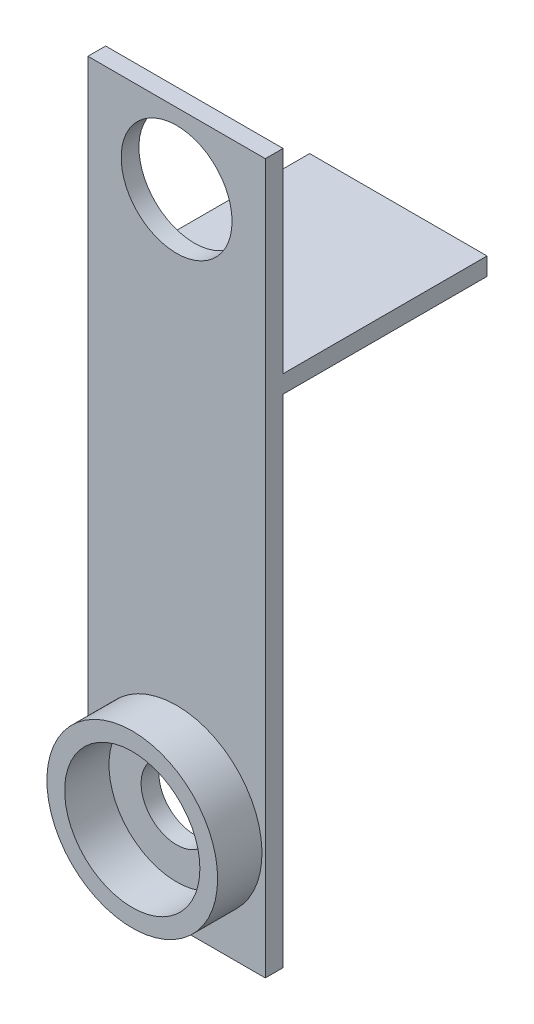
ISO-10303-21;
HEADER;
FILE_DESCRIPTION(('STEP AP214'),'2;1');
FILE_NAME('part.step','',(''),(''),'','','');
FILE_SCHEMA(('AUTOMOTIVE_DESIGN { 1 0 10303 214 1 1 1 1 }'));
ENDSEC;
DATA;
#1=APPLICATION_CONTEXT('core data for automotive mechanical design processes');
#2=APPLICATION_PROTOCOL_DEFINITION('international standard','automotive_design',2000,#1);
#3=PRODUCT_CONTEXT('',#1,'mechanical');
#4=PRODUCT('Part','Part','',(#3));
#5=PRODUCT_RELATED_PRODUCT_CATEGORY('part','',(#4));
#6=PRODUCT_DEFINITION_FORMATION('','',#4);
#7=PRODUCT_DEFINITION_CONTEXT('part definition',#1,'design');
#8=PRODUCT_DEFINITION('design','',#6,#7);
#9=PRODUCT_DEFINITION_SHAPE('','',#8);
#10=(LENGTH_UNIT() NAMED_UNIT(*) SI_UNIT(.MILLI.,.METRE.));
#11=(NAMED_UNIT(*) PLANE_ANGLE_UNIT() SI_UNIT($,.RADIAN.));
#12=(NAMED_UNIT(*) SI_UNIT($,.STERADIAN.) SOLID_ANGLE_UNIT());
#13=UNCERTAINTY_MEASURE_WITH_UNIT(LENGTH_MEASURE(1.E-05),#10,'distance_accuracy_value','');
#14=(GEOMETRIC_REPRESENTATION_CONTEXT(3) GLOBAL_UNCERTAINTY_ASSIGNED_CONTEXT((#13)) GLOBAL_UNIT_ASSIGNED_CONTEXT((#10,
#11,#12)) REPRESENTATION_CONTEXT('',''));
#15=CARTESIAN_POINT('',(0.,0.,0.));
#16=DIRECTION('',(0.,0.,1.));
#17=DIRECTION('',(1.,0.,0.));
#18=AXIS2_PLACEMENT_3D('',#15,#16,#17);
#19=CARTESIAN_POINT('',(20.,22.,2.));
#20=DIRECTION('',(0.,0.,-1.));
#21=DIRECTION('',(0.,1.,0.));
#22=AXIS2_PLACEMENT_3D('',#19,#20,#21);
#23=PLANE('',#22);
#24=CARTESIAN_POINT('',(10.,-46.,2.));
#25=DIRECTION('',(0.,0.,1.));
#26=DIRECTION('',(1.,0.,0.));
#27=AXIS2_PLACEMENT_3D('',#24,#25,#26);
#28=CIRCLE('',#27,4.);
#29=CARTESIAN_POINT('',(14.,-46.,2.));
#30=VERTEX_POINT('',#29);
#31=EDGE_CURVE('E260',#30,#30,#28,.T.);
#32=ORIENTED_EDGE('',*,*,#31,.F.);
#33=EDGE_LOOP('',(#32));
#34=FACE_BOUND('',#33,.T.);
#35=CARTESIAN_POINT('',(10.,-46.,2.));
#36=DIRECTION('',(0.,0.,1.));
#37=DIRECTION('',(1.,0.,0.));
#38=AXIS2_PLACEMENT_3D('',#35,#36,#37);
#39=CIRCLE('',#38,7.625);
#40=CARTESIAN_POINT('',(17.625,-46.,2.));
#41=VERTEX_POINT('',#40);
#42=EDGE_CURVE('E270',#41,#41,#39,.T.);
#43=ORIENTED_EDGE('',*,*,#42,.T.);
#44=EDGE_LOOP('',(#43));
#45=FACE_BOUND('',#44,.T.);
#46=ADVANCED_FACE('F39',(#34,#45),#23,.F.);
#47=CARTESIAN_POINT('',(20.,22.,2.));
#48=DIRECTION('',(0.,-1.,0.));
#49=DIRECTION('',(0.,0.,-1.));
#50=AXIS2_PLACEMENT_3D('',#47,#48,#49);
#51=PLANE('',#50);
#52=DIRECTION('',(0.,0.,1.));
#53=VECTOR('',#52,1.);
#54=CARTESIAN_POINT('',(0.,22.,2.));
#55=LINE('',#54,#53);
#56=CARTESIAN_POINT('',(0.,22.,0.));
#57=VERTEX_POINT('',#56);
#58=CARTESIAN_POINT('',(0.,22.,2.));
#59=VERTEX_POINT('',#58);
#60=EDGE_CURVE('E142',#57,#59,#55,.T.);
#61=ORIENTED_EDGE('',*,*,#60,.T.);
#62=DIRECTION('',(-1.,0.,0.));
#63=VECTOR('',#62,1.);
#64=CARTESIAN_POINT('',(20.,22.,2.));
#65=LINE('',#64,#63);
#66=CARTESIAN_POINT('',(20.,22.,2.));
#67=VERTEX_POINT('',#66);
#68=EDGE_CURVE('E49',#67,#59,#65,.T.);
#69=ORIENTED_EDGE('',*,*,#68,.F.);
#70=DIRECTION('',(0.,0.,1.));
#71=VECTOR('',#70,1.);
#72=CARTESIAN_POINT('',(20.,22.,2.));
#73=LINE('',#72,#71);
#74=CARTESIAN_POINT('',(20.,22.,0.));
#75=VERTEX_POINT('',#74);
#76=EDGE_CURVE('E165',#75,#67,#73,.T.);
#77=ORIENTED_EDGE('',*,*,#76,.F.);
#78=DIRECTION('',(-1.,0.,0.));
#79=VECTOR('',#78,1.);
#80=CARTESIAN_POINT('',(20.,22.,0.));
#81=LINE('',#80,#79);
#82=EDGE_CURVE('E138',#75,#57,#81,.T.);
#83=ORIENTED_EDGE('',*,*,#82,.T.);
#84=EDGE_LOOP('',(#61,#69,#77,#83));
#85=FACE_BOUND('',#84,.T.);
#86=ADVANCED_FACE('F41',(#85),#51,.F.);
#87=CARTESIAN_POINT('',(10.,-46.,1.99999999999999));
#88=DIRECTION('',(0.,0.,-1.));
#89=DIRECTION('',(0.,1.,0.));
#90=AXIS2_PLACEMENT_3D('',#87,#88,#89);
#91=CIRCLE('',#90,9.625);
#92=CARTESIAN_POINT('',(10.,-36.375,1.99999999999999));
#93=VERTEX_POINT('',#92);
#94=EDGE_CURVE('E11',#93,#93,#91,.F.);
#95=ORIENTED_EDGE('',*,*,#94,.F.);
#96=EDGE_LOOP('',(#95));
#97=FACE_BOUND('',#96,.T.);
#98=CARTESIAN_POINT('',(10.,14.,2.));
#99=DIRECTION('',(0.,0.,1.));
#100=DIRECTION('',(1.,0.,0.));
#101=AXIS2_PLACEMENT_3D('',#98,#99,#100);
#102=CIRCLE('',#101,6.25);
#103=CARTESIAN_POINT('',(16.25,14.,2.));
#104=VERTEX_POINT('',#103);
#105=EDGE_CURVE('E189',#104,#104,#102,.T.);
#106=ORIENTED_EDGE('',*,*,#105,.F.);
#107=EDGE_LOOP('',(#106));
#108=FACE_BOUND('',#107,.T.);
#109=DIRECTION('',(0.,-1.,0.));
#110=VECTOR('',#109,1.);
#111=CARTESIAN_POINT('',(0.,22.,2.));
#112=LINE('',#111,#110);
#113=CARTESIAN_POINT('',(0.,-58.,1.99999999999999));
#114=VERTEX_POINT('',#113);
#115=EDGE_CURVE('E146',#59,#114,#112,.T.);
#116=ORIENTED_EDGE('',*,*,#115,.T.);
#117=DIRECTION('',(-1.,0.,0.));
#118=VECTOR('',#117,1.);
#119=CARTESIAN_POINT('',(20.,-58.,1.99999999999999));
#120=LINE('',#119,#118);
#121=CARTESIAN_POINT('',(20.,-58.,1.99999999999999));
#122=VERTEX_POINT('',#121);
#123=EDGE_CURVE('E180',#122,#114,#120,.T.);
#124=ORIENTED_EDGE('',*,*,#123,.F.);
#125=DIRECTION('',(0.,-1.,0.));
#126=VECTOR('',#125,1.);
#127=CARTESIAN_POINT('',(20.,22.,2.));
#128=LINE('',#127,#126);
#129=EDGE_CURVE('E101',#67,#122,#128,.T.);
#130=ORIENTED_EDGE('',*,*,#129,.F.);
#131=ORIENTED_EDGE('',*,*,#68,.T.);
#132=EDGE_LOOP('',(#116,#124,#130,#131));
#133=FACE_BOUND('',#132,.T.);
#134=ADVANCED_FACE('F217',(#97,#108,#133),#23,.F.);
#135=CARTESIAN_POINT('',(20.,-58.,1.99999999999999));
#136=DIRECTION('',(0.,1.,0.));
#137=DIRECTION('',(0.,0.,1.));
#138=AXIS2_PLACEMENT_3D('',#135,#136,#137);
#139=PLANE('',#138);
#140=DIRECTION('',(0.,0.,-1.));
#141=VECTOR('',#140,1.);
#142=CARTESIAN_POINT('',(0.,-58.,1.99999999999999));
#143=LINE('',#142,#141);
#144=CARTESIAN_POINT('',(0.,-58.,0.));
#145=VERTEX_POINT('',#144);
#146=EDGE_CURVE('E150',#114,#145,#143,.T.);
#147=ORIENTED_EDGE('',*,*,#146,.T.);
#148=DIRECTION('',(-1.,0.,0.));
#149=VECTOR('',#148,1.);
#150=CARTESIAN_POINT('',(20.,-58.,0.));
#151=LINE('',#150,#149);
#152=CARTESIAN_POINT('',(20.,-58.,0.));
#153=VERTEX_POINT('',#152);
#154=EDGE_CURVE('E176',#153,#145,#151,.T.);
#155=ORIENTED_EDGE('',*,*,#154,.F.);
#156=DIRECTION('',(0.,0.,-1.));
#157=VECTOR('',#156,1.);
#158=CARTESIAN_POINT('',(20.,-58.,1.99999999999999));
#159=LINE('',#158,#157);
#160=EDGE_CURVE('E242',#122,#153,#159,.T.);
#161=ORIENTED_EDGE('',*,*,#160,.F.);
#162=ORIENTED_EDGE('',*,*,#123,.T.);
#163=EDGE_LOOP('',(#147,#155,#161,#162));
#164=FACE_BOUND('',#163,.T.);
#165=ADVANCED_FACE('F226',(#164),#139,.F.);
#166=CARTESIAN_POINT('',(20.,-58.,0.));
#167=DIRECTION('',(0.,0.,1.));
#168=DIRECTION('',(1.,0.,0.));
#169=AXIS2_PLACEMENT_3D('',#166,#167,#168);
#170=PLANE('',#169);
#171=CARTESIAN_POINT('',(10.,-46.,0.));
#172=DIRECTION('',(0.,0.,1.));
#173=DIRECTION('',(1.,0.,0.));
#174=AXIS2_PLACEMENT_3D('',#171,#172,#173);
#175=CIRCLE('',#174,4.);
#176=CARTESIAN_POINT('',(14.,-46.,0.));
#177=VERTEX_POINT('',#176);
#178=EDGE_CURVE('E147',#177,#177,#175,.T.);
#179=ORIENTED_EDGE('',*,*,#178,.T.);
#180=EDGE_LOOP('',(#179));
#181=FACE_BOUND('',#180,.T.);
#182=DIRECTION('',(0.,1.,0.));
#183=VECTOR('',#182,1.);
#184=CARTESIAN_POINT('',(0.,-58.,0.));
#185=LINE('',#184,#183);
#186=CARTESIAN_POINT('',(0.,-2.,0.));
#187=VERTEX_POINT('',#186);
#188=EDGE_CURVE('E153',#145,#187,#185,.T.);
#189=ORIENTED_EDGE('',*,*,#188,.T.);
#190=DIRECTION('',(-1.,0.,0.));
#191=VECTOR('',#190,1.);
#192=CARTESIAN_POINT('',(20.,-2.,0.));
#193=LINE('',#192,#191);
#194=CARTESIAN_POINT('',(20.,-2.,0.));
#195=VERTEX_POINT('',#194);
#196=EDGE_CURVE('E172',#195,#187,#193,.T.);
#197=ORIENTED_EDGE('',*,*,#196,.F.);
#198=DIRECTION('',(0.,1.,0.));
#199=VECTOR('',#198,1.);
#200=CARTESIAN_POINT('',(20.,-58.,0.));
#201=LINE('',#200,#199);
#202=EDGE_CURVE('E250',#153,#195,#201,.T.);
#203=ORIENTED_EDGE('',*,*,#202,.F.);
#204=ORIENTED_EDGE('',*,*,#154,.T.);
#205=EDGE_LOOP('',(#189,#197,#203,#204));
#206=FACE_BOUND('',#205,.T.);
#207=ADVANCED_FACE('F194',(#181,#206),#170,.F.);
#208=CARTESIAN_POINT('',(20.,-2.,0.));
#209=DIRECTION('',(0.,1.,0.));
#210=DIRECTION('',(0.,0.,1.));
#211=AXIS2_PLACEMENT_3D('',#208,#209,#210);
#212=PLANE('',#211);
#213=DIRECTION('',(0.,0.,-1.));
#214=VECTOR('',#213,1.);
#215=CARTESIAN_POINT('',(0.,-2.,0.));
#216=LINE('',#215,#214);
#217=CARTESIAN_POINT('',(0.,-2.,-23.));
#218=VERTEX_POINT('',#217);
#219=EDGE_CURVE('E156',#187,#218,#216,.T.);
#220=ORIENTED_EDGE('',*,*,#219,.T.);
#221=DIRECTION('',(-1.,0.,0.));
#222=VECTOR('',#221,1.);
#223=CARTESIAN_POINT('',(20.,-2.,-23.));
#224=LINE('',#223,#222);
#225=CARTESIAN_POINT('',(20.,-2.,-23.));
#226=VERTEX_POINT('',#225);
#227=EDGE_CURVE('E131',#226,#218,#224,.T.);
#228=ORIENTED_EDGE('',*,*,#227,.F.);
#229=DIRECTION('',(0.,0.,-1.));
#230=VECTOR('',#229,1.);
#231=CARTESIAN_POINT('',(20.,-2.,0.));
#232=LINE('',#231,#230);
#233=EDGE_CURVE('E120',#195,#226,#232,.T.);
#234=ORIENTED_EDGE('',*,*,#233,.F.);
#235=ORIENTED_EDGE('',*,*,#196,.T.);
#236=EDGE_LOOP('',(#220,#228,#234,#235));
#237=FACE_BOUND('',#236,.T.);
#238=ADVANCED_FACE('F248',(#237),#212,.F.);
#239=CARTESIAN_POINT('',(20.,0.,-23.));
#240=DIRECTION('',(0.,0.,1.));
#241=DIRECTION('',(1.,0.,0.));
#242=AXIS2_PLACEMENT_3D('',#239,#240,#241);
#243=PLANE('',#242);
#244=DIRECTION('',(0.,1.,0.));
#245=VECTOR('',#244,1.);
#246=CARTESIAN_POINT('',(0.,0.,-23.));
#247=LINE('',#246,#245);
#248=CARTESIAN_POINT('',(0.,0.,-23.));
#249=VERTEX_POINT('',#248);
#250=EDGE_CURVE('E129',#218,#249,#247,.T.);
#251=ORIENTED_EDGE('',*,*,#250,.T.);
#252=DIRECTION('',(-1.,0.,0.));
#253=VECTOR('',#252,1.);
#254=CARTESIAN_POINT('',(20.,0.,-23.));
#255=LINE('',#254,#253);
#256=CARTESIAN_POINT('',(20.,0.,-23.));
#257=VERTEX_POINT('',#256);
#258=EDGE_CURVE('E126',#257,#249,#255,.T.);
#259=ORIENTED_EDGE('',*,*,#258,.F.);
#260=DIRECTION('',(0.,1.,0.));
#261=VECTOR('',#260,1.);
#262=CARTESIAN_POINT('',(20.,0.,-23.));
#263=LINE('',#262,#261);
#264=EDGE_CURVE('E114',#226,#257,#263,.T.);
#265=ORIENTED_EDGE('',*,*,#264,.F.);
#266=ORIENTED_EDGE('',*,*,#227,.T.);
#267=EDGE_LOOP('',(#251,#259,#265,#266));
#268=FACE_BOUND('',#267,.T.);
#269=ADVANCED_FACE('F127',(#268),#243,.F.);
#270=CARTESIAN_POINT('',(20.,0.,0.));
#271=DIRECTION('',(0.,-1.,0.));
#272=DIRECTION('',(0.,0.,-1.));
#273=AXIS2_PLACEMENT_3D('',#270,#271,#272);
#274=PLANE('',#273);
#275=DIRECTION('',(0.,0.,1.));
#276=VECTOR('',#275,1.);
#277=CARTESIAN_POINT('',(0.,0.,0.));
#278=LINE('',#277,#276);
#279=CARTESIAN_POINT('',(0.,0.,0.));
#280=VERTEX_POINT('',#279);
#281=EDGE_CURVE('E86',#249,#280,#278,.T.);
#282=ORIENTED_EDGE('',*,*,#281,.T.);
#283=DIRECTION('',(-1.,0.,0.));
#284=VECTOR('',#283,1.);
#285=CARTESIAN_POINT('',(20.,0.,0.));
#286=LINE('',#285,#284);
#287=CARTESIAN_POINT('',(20.,0.,0.));
#288=VERTEX_POINT('',#287);
#289=EDGE_CURVE('E132',#288,#280,#286,.T.);
#290=ORIENTED_EDGE('',*,*,#289,.F.);
#291=DIRECTION('',(0.,0.,1.));
#292=VECTOR('',#291,1.);
#293=CARTESIAN_POINT('',(20.,0.,0.));
#294=LINE('',#293,#292);
#295=EDGE_CURVE('E118',#257,#288,#294,.T.);
#296=ORIENTED_EDGE('',*,*,#295,.F.);
#297=ORIENTED_EDGE('',*,*,#258,.T.);
#298=EDGE_LOOP('',(#282,#290,#296,#297));
#299=FACE_BOUND('',#298,.T.);
#300=ADVANCED_FACE('F134',(#299),#274,.F.);
#301=CARTESIAN_POINT('',(20.,22.,0.));
#302=DIRECTION('',(0.,0.,1.));
#303=DIRECTION('',(0.,-1.,0.));
#304=AXIS2_PLACEMENT_3D('',#301,#302,#303);
#305=PLANE('',#304);
#306=CARTESIAN_POINT('',(10.,14.,0.));
#307=DIRECTION('',(0.,0.,1.));
#308=DIRECTION('',(0.,-1.,0.));
#309=AXIS2_PLACEMENT_3D('',#306,#307,#308);
#310=CIRCLE('',#309,6.25);
#311=CARTESIAN_POINT('',(10.,7.75,0.));
#312=VERTEX_POINT('',#311);
#313=EDGE_CURVE('E186',#312,#312,#310,.T.);
#314=ORIENTED_EDGE('',*,*,#313,.T.);
#315=EDGE_LOOP('',(#314));
#316=FACE_BOUND('',#315,.T.);
#317=DIRECTION('',(0.,1.,0.));
#318=VECTOR('',#317,1.);
#319=CARTESIAN_POINT('',(0.,22.,0.));
#320=LINE('',#319,#318);
#321=EDGE_CURVE('E92',#280,#57,#320,.T.);
#322=ORIENTED_EDGE('',*,*,#321,.T.);
#323=ORIENTED_EDGE('',*,*,#82,.F.);
#324=DIRECTION('',(0.,1.,0.));
#325=VECTOR('',#324,1.);
#326=CARTESIAN_POINT('',(20.,22.,0.));
#327=LINE('',#326,#325);
#328=EDGE_CURVE('E57',#288,#75,#327,.T.);
#329=ORIENTED_EDGE('',*,*,#328,.F.);
#330=ORIENTED_EDGE('',*,*,#289,.T.);
#331=EDGE_LOOP('',(#322,#323,#329,#330));
#332=FACE_BOUND('',#331,.T.);
#333=ADVANCED_FACE('F324',(#316,#332),#305,.F.);
#334=CARTESIAN_POINT('',(20.,0.,0.));
#335=DIRECTION('',(-1.,0.,0.));
#336=DIRECTION('',(0.,0.,1.));
#337=AXIS2_PLACEMENT_3D('',#334,#335,#336);
#338=PLANE('',#337);
#339=ORIENTED_EDGE('',*,*,#76,.T.);
#340=ORIENTED_EDGE('',*,*,#129,.T.);
#341=ORIENTED_EDGE('',*,*,#160,.T.);
#342=ORIENTED_EDGE('',*,*,#202,.T.);
#343=ORIENTED_EDGE('',*,*,#233,.T.);
#344=ORIENTED_EDGE('',*,*,#264,.T.);
#345=ORIENTED_EDGE('',*,*,#295,.T.);
#346=ORIENTED_EDGE('',*,*,#328,.T.);
#347=EDGE_LOOP('',(#339,#340,#341,#342,#343,#344,#345,#346));
#348=FACE_BOUND('',#347,.T.);
#349=ADVANCED_FACE('F116',(#348),#338,.F.);
#350=CARTESIAN_POINT('',(0.,0.,0.));
#351=DIRECTION('',(-1.,0.,0.));
#352=DIRECTION('',(0.,0.,1.));
#353=AXIS2_PLACEMENT_3D('',#350,#351,#352);
#354=PLANE('',#353);
#355=ORIENTED_EDGE('',*,*,#60,.F.);
#356=ORIENTED_EDGE('',*,*,#321,.F.);
#357=ORIENTED_EDGE('',*,*,#281,.F.);
#358=ORIENTED_EDGE('',*,*,#250,.F.);
#359=ORIENTED_EDGE('',*,*,#219,.F.);
#360=ORIENTED_EDGE('',*,*,#188,.F.);
#361=ORIENTED_EDGE('',*,*,#146,.F.);
#362=ORIENTED_EDGE('',*,*,#115,.F.);
#363=EDGE_LOOP('',(#355,#356,#357,#358,#359,#360,#361,#362));
#364=FACE_BOUND('',#363,.T.);
#365=ADVANCED_FACE('F210',(#364),#354,.T.);
#366=CARTESIAN_POINT('',(10.,14.,-13.));
#367=DIRECTION('',(0.,0.,1.));
#368=DIRECTION('',(1.,0.,0.));
#369=AXIS2_PLACEMENT_3D('',#366,#367,#368);
#370=CYLINDRICAL_SURFACE('',#369,6.25);
#371=ORIENTED_EDGE('',*,*,#105,.T.);
#372=EDGE_LOOP('',(#371));
#373=FACE_BOUND('',#372,.T.);
#374=ORIENTED_EDGE('',*,*,#313,.F.);
#375=EDGE_LOOP('',(#374));
#376=FACE_BOUND('',#375,.T.);
#377=ADVANCED_FACE('F200',(#373,#376),#370,.F.);
#378=CARTESIAN_POINT('',(10.,-46.,-13.));
#379=DIRECTION('',(0.,0.,1.));
#380=DIRECTION('',(1.,0.,0.));
#381=AXIS2_PLACEMENT_3D('',#378,#379,#380);
#382=CYLINDRICAL_SURFACE('',#381,4.);
#383=ORIENTED_EDGE('',*,*,#31,.T.);
#384=EDGE_LOOP('',(#383));
#385=FACE_BOUND('',#384,.T.);
#386=ORIENTED_EDGE('',*,*,#178,.F.);
#387=EDGE_LOOP('',(#386));
#388=FACE_BOUND('',#387,.T.);
#389=ADVANCED_FACE('F197',(#385,#388),#382,.F.);
#390=CARTESIAN_POINT('',(10.,-46.,7.));
#391=DIRECTION('',(0.,0.,1.));
#392=DIRECTION('',(1.,0.,0.));
#393=AXIS2_PLACEMENT_3D('',#390,#391,#392);
#394=PLANE('',#393);
#395=CARTESIAN_POINT('',(10.,-46.,7.));
#396=DIRECTION('',(0.,0.,1.));
#397=DIRECTION('',(1.,0.,0.));
#398=AXIS2_PLACEMENT_3D('',#395,#396,#397);
#399=CIRCLE('',#398,9.625);
#400=CARTESIAN_POINT('',(19.625,-46.,7.));
#401=VERTEX_POINT('',#400);
#402=EDGE_CURVE('E263',#401,#401,#399,.T.);
#403=ORIENTED_EDGE('',*,*,#402,.T.);
#404=EDGE_LOOP('',(#403));
#405=FACE_BOUND('',#404,.T.);
#406=CARTESIAN_POINT('',(10.,-46.,7.));
#407=DIRECTION('',(0.,0.,1.));
#408=DIRECTION('',(1.,0.,0.));
#409=AXIS2_PLACEMENT_3D('',#406,#407,#408);
#410=CIRCLE('',#409,7.625);
#411=CARTESIAN_POINT('',(17.625,-46.,7.));
#412=VERTEX_POINT('',#411);
#413=EDGE_CURVE('E269',#412,#412,#410,.T.);
#414=ORIENTED_EDGE('',*,*,#413,.F.);
#415=EDGE_LOOP('',(#414));
#416=FACE_BOUND('',#415,.T.);
#417=ADVANCED_FACE('F199',(#405,#416),#394,.T.);
#418=CARTESIAN_POINT('',(10.,-46.,7.));
#419=DIRECTION('',(0.,0.,-1.));
#420=DIRECTION('',(-1.,0.,0.));
#421=AXIS2_PLACEMENT_3D('',#418,#419,#420);
#422=CYLINDRICAL_SURFACE('',#421,9.625);
#423=ORIENTED_EDGE('',*,*,#402,.F.);
#424=EDGE_LOOP('',(#423));
#425=FACE_BOUND('',#424,.T.);
#426=ORIENTED_EDGE('',*,*,#94,.T.);
#427=EDGE_LOOP('',(#426));
#428=FACE_BOUND('',#427,.T.);
#429=ADVANCED_FACE('F207',(#425,#428),#422,.T.);
#430=CARTESIAN_POINT('',(10.,-46.,7.));
#431=DIRECTION('',(0.,0.,-1.));
#432=DIRECTION('',(-1.,0.,0.));
#433=AXIS2_PLACEMENT_3D('',#430,#431,#432);
#434=CYLINDRICAL_SURFACE('',#433,7.625);
#435=ORIENTED_EDGE('',*,*,#413,.T.);
#436=EDGE_LOOP('',(#435));
#437=FACE_BOUND('',#436,.T.);
#438=ORIENTED_EDGE('',*,*,#42,.F.);
#439=EDGE_LOOP('',(#438));
#440=FACE_BOUND('',#439,.T.);
#441=ADVANCED_FACE('F278',(#437,#440),#434,.F.);
#442=CLOSED_SHELL('',(#46,#86,#134,#165,#207,#238,#269,#300,#333,#349,#365,#377,#389,#417,#429,#441));
#443=MANIFOLD_SOLID_BREP('B2',#442);
#444=ADVANCED_BREP_SHAPE_REPRESENTATION('',(#18,#443),#14);
#445=SHAPE_DEFINITION_REPRESENTATION(#9,#444);
ENDSEC;
END-ISO-10303-21;
